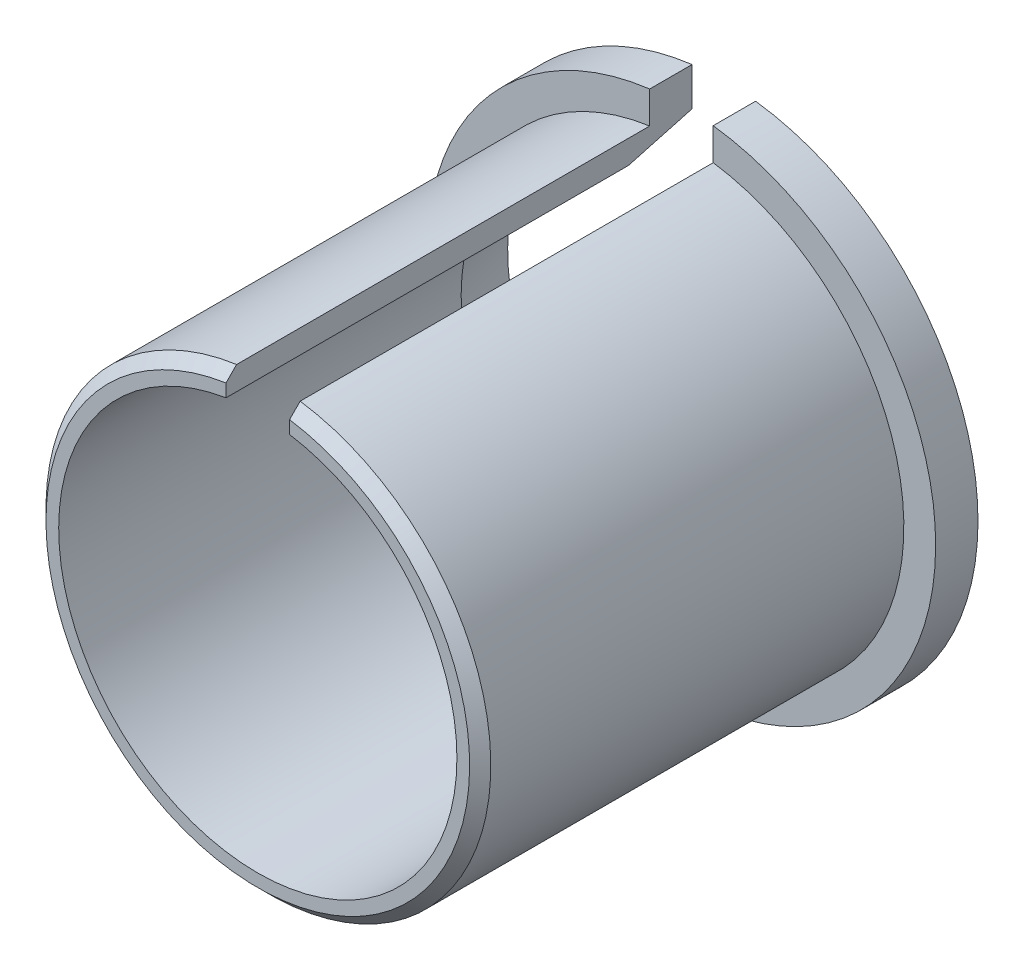
ISO-10303-21;
HEADER;
FILE_DESCRIPTION(('STEP AP214'),'2;1');
FILE_NAME('part.step','',(''),(''),'','','');
FILE_SCHEMA(('AUTOMOTIVE_DESIGN { 1 0 10303 214 1 1 1 1 }'));
ENDSEC;
DATA;
#1=APPLICATION_CONTEXT('core data for automotive mechanical design processes');
#2=APPLICATION_PROTOCOL_DEFINITION('international standard','automotive_design',2000,#1);
#3=PRODUCT_CONTEXT('',#1,'mechanical');
#4=PRODUCT('Part','Part','',(#3));
#5=PRODUCT_RELATED_PRODUCT_CATEGORY('part','',(#4));
#6=PRODUCT_DEFINITION_FORMATION('','',#4);
#7=PRODUCT_DEFINITION_CONTEXT('part definition',#1,'design');
#8=PRODUCT_DEFINITION('design','',#6,#7);
#9=PRODUCT_DEFINITION_SHAPE('','',#8);
#10=(LENGTH_UNIT() NAMED_UNIT(*) SI_UNIT(.MILLI.,.METRE.));
#11=(NAMED_UNIT(*) PLANE_ANGLE_UNIT() SI_UNIT($,.RADIAN.));
#12=(NAMED_UNIT(*) SI_UNIT($,.STERADIAN.) SOLID_ANGLE_UNIT());
#13=UNCERTAINTY_MEASURE_WITH_UNIT(LENGTH_MEASURE(1.E-05),#10,'distance_accuracy_value','');
#14=(GEOMETRIC_REPRESENTATION_CONTEXT(3) GLOBAL_UNCERTAINTY_ASSIGNED_CONTEXT((#13)) GLOBAL_UNIT_ASSIGNED_CONTEXT((#10,
#11,#12)) REPRESENTATION_CONTEXT('',''));
#15=CARTESIAN_POINT('',(0.,0.,0.));
#16=DIRECTION('',(0.,0.,1.));
#17=DIRECTION('',(1.,0.,0.));
#18=AXIS2_PLACEMENT_3D('',#15,#16,#17);
#19=CARTESIAN_POINT('',(0.,0.,-22.));
#20=DIRECTION('',(0.,0.,-1.));
#21=DIRECTION('',(-1.,0.,0.));
#22=AXIS2_PLACEMENT_3D('',#19,#20,#21);
#23=CONICAL_SURFACE('',#22,10.2038475772934,0.261799387799151);
#24=CARTESIAN_POINT('',(0.,0.,-19.));
#25=DIRECTION('',(0.,0.,1.));
#26=DIRECTION('',(1.,0.,0.));
#27=AXIS2_PLACEMENT_3D('',#24,#25,#26);
#28=CIRCLE('',#27,9.4);
#29=CARTESIAN_POINT('',(-1.5,9.27954740275623,-19.));
#30=VERTEX_POINT('',#29);
#31=CARTESIAN_POINT('',(1.5,9.27954740275623,-19.));
#32=VERTEX_POINT('',#31);
#33=EDGE_CURVE('E77',#30,#32,#28,.T.);
#34=ORIENTED_EDGE('',*,*,#33,.T.);
#35=CARTESIAN_POINT('',(1.5,9.27954740275624,-19.));
#36=CARTESIAN_POINT('',(1.5,9.41524604775006,-19.4999662700318));
#37=CARTESIAN_POINT('',(1.5,9.55088249382668,-19.9999494052064));
#38=CARTESIAN_POINT('',(1.5,9.82203098797341,-20.9999494052064));
#39=CARTESIAN_POINT('',(1.5,9.9575430360437,-21.4999662700319));
#40=CARTESIAN_POINT('',(1.5,10.0929928851969,-22.));
#41=B_SPLINE_CURVE_WITH_KNOTS('',3,(#35,#36,#37,#38,#39,#40),.UNSPECIFIED.,.F.,.F.,(4,2,4),(0.,
1.55416325676213,3.10832651155186),.UNSPECIFIED.);
#42=CARTESIAN_POINT('',(1.5,10.0929928851969,-22.));
#43=VERTEX_POINT('',#42);
#44=EDGE_CURVE('E73',#32,#43,#41,.T.);
#45=ORIENTED_EDGE('',*,*,#44,.T.);
#46=CARTESIAN_POINT('',(0.,0.,-22.));
#47=DIRECTION('',(0.,0.,-1.));
#48=DIRECTION('',(-1.,0.,0.));
#49=AXIS2_PLACEMENT_3D('',#46,#47,#48);
#50=CIRCLE('',#49,10.2038475772934);
#51=CARTESIAN_POINT('',(-1.5,10.0929928851969,-22.));
#52=VERTEX_POINT('',#51);
#53=EDGE_CURVE('E20',#43,#52,#50,.T.);
#54=ORIENTED_EDGE('',*,*,#53,.T.);
#55=CARTESIAN_POINT('',(-1.5,10.0929928851969,-22.));
#56=CARTESIAN_POINT('',(-1.5,9.9575430360437,-21.4999662700319));
#57=CARTESIAN_POINT('',(-1.5,9.82203098797341,-20.9999494052064));
#58=CARTESIAN_POINT('',(-1.5,9.55088249382667,-19.9999494052064));
#59=CARTESIAN_POINT('',(-1.5,9.41524604775006,-19.4999662700318));
#60=CARTESIAN_POINT('',(-1.5,9.27954740275623,-19.));
#61=B_SPLINE_CURVE_WITH_KNOTS('',3,(#55,#56,#57,#58,#59,#60),.UNSPECIFIED.,.F.,.F.,(4,2,4),(0.,
1.55416325478973,3.10832651155186),.UNSPECIFIED.);
#62=EDGE_CURVE('E70',#52,#30,#61,.T.);
#63=ORIENTED_EDGE('',*,*,#62,.T.);
#64=EDGE_LOOP('',(#34,#45,#54,#63));
#65=FACE_BOUND('',#64,.T.);
#66=ADVANCED_FACE('F16',(#65),#23,.F.);
#67=CARTESIAN_POINT('',(0.,12.,-22.));
#68=DIRECTION('',(0.,0.,1.));
#69=DIRECTION('',(1.,0.,0.));
#70=AXIS2_PLACEMENT_3D('',#67,#68,#69);
#71=PLANE('',#70);
#72=DIRECTION('',(0.,-1.,0.));
#73=VECTOR('',#72,1.);
#74=CARTESIAN_POINT('',(-1.5,11.9058808997907,-22.));
#75=LINE('',#74,#73);
#76=CARTESIAN_POINT('',(-1.5,11.9058808997907,-22.));
#77=VERTEX_POINT('',#76);
#78=EDGE_CURVE('E79',#77,#52,#75,.T.);
#79=ORIENTED_EDGE('',*,*,#78,.T.);
#80=ORIENTED_EDGE('',*,*,#53,.F.);
#81=DIRECTION('',(0.,1.,0.));
#82=VECTOR('',#81,1.);
#83=CARTESIAN_POINT('',(1.5,11.9058808997907,-22.));
#84=LINE('',#83,#82);
#85=CARTESIAN_POINT('',(1.5,11.9058808997907,-22.));
#86=VERTEX_POINT('',#85);
#87=EDGE_CURVE('E144',#43,#86,#84,.T.);
#88=ORIENTED_EDGE('',*,*,#87,.T.);
#89=CARTESIAN_POINT('',(0.,0.,-22.));
#90=DIRECTION('',(0.,0.,1.));
#91=DIRECTION('',(1.,0.,0.));
#92=AXIS2_PLACEMENT_3D('',#89,#90,#91);
#93=CIRCLE('',#92,12.);
#94=EDGE_CURVE('E81',#77,#86,#93,.T.);
#95=ORIENTED_EDGE('',*,*,#94,.F.);
#96=EDGE_LOOP('',(#79,#80,#88,#95));
#97=FACE_BOUND('',#96,.T.);
#98=ADVANCED_FACE('F80',(#97),#71,.F.);
#99=CARTESIAN_POINT('',(0.,0.,0.));
#100=DIRECTION('',(0.,0.,1.));
#101=DIRECTION('',(1.,0.,0.));
#102=AXIS2_PLACEMENT_3D('',#99,#100,#101);
#103=CYLINDRICAL_SURFACE('',#102,9.4);
#104=ORIENTED_EDGE('',*,*,#33,.F.);
#105=DIRECTION('',(0.,0.,1.));
#106=VECTOR('',#105,1.);
#107=CARTESIAN_POINT('',(-1.5,9.27954740275623,-22.001));
#108=LINE('',#107,#106);
#109=CARTESIAN_POINT('',(-1.5,9.27954740275623,0.));
#110=VERTEX_POINT('',#109);
#111=EDGE_CURVE('E91',#30,#110,#108,.T.);
#112=ORIENTED_EDGE('',*,*,#111,.T.);
#113=CARTESIAN_POINT('',(0.,0.,0.));
#114=DIRECTION('',(0.,0.,1.));
#115=DIRECTION('',(1.,0.,0.));
#116=AXIS2_PLACEMENT_3D('',#113,#114,#115);
#117=CIRCLE('',#116,9.4);
#118=CARTESIAN_POINT('',(1.5,9.27954740275623,0.));
#119=VERTEX_POINT('',#118);
#120=EDGE_CURVE('E145',#110,#119,#117,.T.);
#121=ORIENTED_EDGE('',*,*,#120,.T.);
#122=DIRECTION('',(0.,0.,1.));
#123=VECTOR('',#122,1.);
#124=CARTESIAN_POINT('',(1.5,9.27954740275623,-22.001));
#125=LINE('',#124,#123);
#126=EDGE_CURVE('E189',#119,#32,#125,.F.);
#127=ORIENTED_EDGE('',*,*,#126,.T.);
#128=EDGE_LOOP('',(#104,#112,#121,#127));
#129=FACE_BOUND('',#128,.T.);
#130=ADVANCED_FACE('F112',(#129),#103,.F.);
#131=CARTESIAN_POINT('',(-1.5,11.9058808997907,-22.001));
#132=DIRECTION('',(-1.,0.,0.));
#133=DIRECTION('',(0.,-1.,0.));
#134=AXIS2_PLACEMENT_3D('',#131,#132,#133);
#135=PLANE('',#134);
#136=DIRECTION('',(0.,0.,1.));
#137=VECTOR('',#136,1.);
#138=CARTESIAN_POINT('',(-1.5,11.9058808997907,0.));
#139=LINE('',#138,#137);
#140=CARTESIAN_POINT('',(-1.5,11.9058808997907,-20.));
#141=VERTEX_POINT('',#140);
#142=EDGE_CURVE('E184',#141,#77,#139,.F.);
#143=ORIENTED_EDGE('',*,*,#142,.F.);
#144=DIRECTION('',(0.,-1.,0.));
#145=VECTOR('',#144,1.);
#146=CARTESIAN_POINT('',(-1.5,11.9058808997907,-20.));
#147=LINE('',#146,#145);
#148=CARTESIAN_POINT('',(-1.5,10.3923048454133,-20.));
#149=VERTEX_POINT('',#148);
#150=EDGE_CURVE('E85',#149,#141,#147,.F.);
#151=ORIENTED_EDGE('',*,*,#150,.F.);
#152=DIRECTION('',(0.,0.,1.));
#153=VECTOR('',#152,1.);
#154=CARTESIAN_POINT('',(-1.5,10.3923048454133,0.));
#155=LINE('',#154,#153);
#156=CARTESIAN_POINT('',(-1.5,10.3923048454133,-0.500000000000002));
#157=VERTEX_POINT('',#156);
#158=EDGE_CURVE('E172',#157,#149,#155,.F.);
#159=ORIENTED_EDGE('',*,*,#158,.F.);
#160=CARTESIAN_POINT('',(-1.5,9.88685996664259,0.));
#161=CARTESIAN_POINT('',(-1.5,9.97112303267183,-0.0833108381771129));
#162=CARTESIAN_POINT('',(-1.5,10.055374972269,-0.166632923950458));
#163=CARTESIAN_POINT('',(-1.5,10.2238565985258,-0.333299590617144));
#164=CARTESIAN_POINT('',(-1.5,10.3080862851856,-0.416644171510467));
#165=CARTESIAN_POINT('',(-1.5,10.3923048454133,-0.500000000000002));
#166=B_SPLINE_CURVE_WITH_KNOTS('',3,(#160,#161,#162,#163,#164,#165),.UNSPECIFIED.,.F.,.F.,(4,2,
4),(0.,0.355483661694203,0.710967323079275),.UNSPECIFIED.);
#167=CARTESIAN_POINT('',(-1.5,9.88685996664259,0.));
#168=VERTEX_POINT('',#167);
#169=EDGE_CURVE('E92',#168,#157,#166,.T.);
#170=ORIENTED_EDGE('',*,*,#169,.F.);
#171=DIRECTION('',(0.,1.,0.));
#172=VECTOR('',#171,1.);
#173=CARTESIAN_POINT('',(-1.5,9.4,0.));
#174=LINE('',#173,#172);
#175=EDGE_CURVE('E165',#168,#110,#174,.F.);
#176=ORIENTED_EDGE('',*,*,#175,.T.);
#177=ORIENTED_EDGE('',*,*,#111,.F.);
#178=ORIENTED_EDGE('',*,*,#62,.F.);
#179=ORIENTED_EDGE('',*,*,#78,.F.);
#180=EDGE_LOOP('',(#143,#151,#159,#170,#176,#177,#178,#179));
#181=FACE_BOUND('',#180,.T.);
#182=ADVANCED_FACE('F88',(#181),#135,.F.);
#183=CARTESIAN_POINT('',(0.,0.,0.));
#184=DIRECTION('',(0.,0.,1.));
#185=DIRECTION('',(1.,0.,0.));
#186=AXIS2_PLACEMENT_3D('',#183,#184,#185);
#187=CYLINDRICAL_SURFACE('',#186,12.);
#188=CARTESIAN_POINT('',(0.,0.,-20.));
#189=DIRECTION('',(0.,0.,1.));
#190=DIRECTION('',(1.,0.,0.));
#191=AXIS2_PLACEMENT_3D('',#188,#189,#190);
#192=CIRCLE('',#191,12.);
#193=CARTESIAN_POINT('',(1.5,11.9058808997907,-20.));
#194=VERTEX_POINT('',#193);
#195=EDGE_CURVE('E180',#194,#141,#192,.F.);
#196=ORIENTED_EDGE('',*,*,#195,.T.);
#197=ORIENTED_EDGE('',*,*,#142,.T.);
#198=ORIENTED_EDGE('',*,*,#94,.T.);
#199=DIRECTION('',(0.,0.,1.));
#200=VECTOR('',#199,1.);
#201=CARTESIAN_POINT('',(1.5,11.9058808997907,-22.001));
#202=LINE('',#201,#200);
#203=EDGE_CURVE('E186',#86,#194,#202,.T.);
#204=ORIENTED_EDGE('',*,*,#203,.T.);
#205=EDGE_LOOP('',(#196,#197,#198,#204));
#206=FACE_BOUND('',#205,.T.);
#207=ADVANCED_FACE('F111',(#206),#187,.T.);
#208=CARTESIAN_POINT('',(1.5,11.9058808997907,-22.001));
#209=DIRECTION('',(1.,0.,0.));
#210=DIRECTION('',(0.,1.,0.));
#211=AXIS2_PLACEMENT_3D('',#208,#209,#210);
#212=PLANE('',#211);
#213=ORIENTED_EDGE('',*,*,#44,.F.);
#214=ORIENTED_EDGE('',*,*,#126,.F.);
#215=DIRECTION('',(0.,1.,0.));
#216=VECTOR('',#215,1.);
#217=CARTESIAN_POINT('',(1.5,9.4,0.));
#218=LINE('',#217,#216);
#219=CARTESIAN_POINT('',(1.5,9.88685996664259,0.));
#220=VERTEX_POINT('',#219);
#221=EDGE_CURVE('E143',#119,#220,#218,.T.);
#222=ORIENTED_EDGE('',*,*,#221,.T.);
#223=CARTESIAN_POINT('',(1.5,10.3923048454133,-0.500000000000002));
#224=CARTESIAN_POINT('',(1.5,10.3080862851856,-0.416644171510467));
#225=CARTESIAN_POINT('',(1.5,10.2238565985258,-0.333299590617145));
#226=CARTESIAN_POINT('',(1.5,10.055374972269,-0.166632923950458));
#227=CARTESIAN_POINT('',(1.5,9.97112303267183,-0.0833108381771128));
#228=CARTESIAN_POINT('',(1.5,9.88685996664259,0.));
#229=B_SPLINE_CURVE_WITH_KNOTS('',3,(#223,#224,#225,#226,#227,#228),.UNSPECIFIED.,.F.,.F.,(4,2,
4),(0.,0.355483661385072,0.710967323079275),.UNSPECIFIED.);
#230=CARTESIAN_POINT('',(1.5,10.3923048454133,-0.500000000000002));
#231=VERTEX_POINT('',#230);
#232=EDGE_CURVE('E136',#231,#220,#229,.T.);
#233=ORIENTED_EDGE('',*,*,#232,.F.);
#234=DIRECTION('',(0.,0.,1.));
#235=VECTOR('',#234,1.);
#236=CARTESIAN_POINT('',(1.5,10.3923048454133,0.));
#237=LINE('',#236,#235);
#238=CARTESIAN_POINT('',(1.5,10.3923048454133,-20.));
#239=VERTEX_POINT('',#238);
#240=EDGE_CURVE('E177',#239,#231,#237,.T.);
#241=ORIENTED_EDGE('',*,*,#240,.F.);
#242=DIRECTION('',(0.,1.,0.));
#243=VECTOR('',#242,1.);
#244=CARTESIAN_POINT('',(1.5,10.5,-20.));
#245=LINE('',#244,#243);
#246=EDGE_CURVE('E183',#239,#194,#245,.T.);
#247=ORIENTED_EDGE('',*,*,#246,.T.);
#248=ORIENTED_EDGE('',*,*,#203,.F.);
#249=ORIENTED_EDGE('',*,*,#87,.F.);
#250=EDGE_LOOP('',(#213,#214,#222,#233,#241,#247,#248,#249));
#251=FACE_BOUND('',#250,.T.);
#252=ADVANCED_FACE('F151',(#251),#212,.F.);
#253=CARTESIAN_POINT('',(0.,9.4,0.));
#254=DIRECTION('',(0.,0.,-1.));
#255=DIRECTION('',(-1.,0.,0.));
#256=AXIS2_PLACEMENT_3D('',#253,#254,#255);
#257=PLANE('',#256);
#258=ORIENTED_EDGE('',*,*,#175,.F.);
#259=CARTESIAN_POINT('',(0.,0.,0.));
#260=DIRECTION('',(0.,0.,-1.));
#261=DIRECTION('',(-1.,0.,0.));
#262=AXIS2_PLACEMENT_3D('',#259,#260,#261);
#263=CIRCLE('',#262,10.);
#264=EDGE_CURVE('E167',#220,#168,#263,.T.);
#265=ORIENTED_EDGE('',*,*,#264,.F.);
#266=ORIENTED_EDGE('',*,*,#221,.F.);
#267=ORIENTED_EDGE('',*,*,#120,.F.);
#268=EDGE_LOOP('',(#258,#265,#266,#267));
#269=FACE_BOUND('',#268,.T.);
#270=ADVANCED_FACE('F154',(#269),#257,.F.);
#271=CARTESIAN_POINT('',(0.,10.5,-20.));
#272=DIRECTION('',(0.,0.,-1.));
#273=DIRECTION('',(-1.,0.,0.));
#274=AXIS2_PLACEMENT_3D('',#271,#272,#273);
#275=PLANE('',#274);
#276=ORIENTED_EDGE('',*,*,#150,.T.);
#277=ORIENTED_EDGE('',*,*,#195,.F.);
#278=ORIENTED_EDGE('',*,*,#246,.F.);
#279=CARTESIAN_POINT('',(0.,0.,-20.));
#280=DIRECTION('',(0.,0.,1.));
#281=DIRECTION('',(1.,0.,0.));
#282=AXIS2_PLACEMENT_3D('',#279,#280,#281);
#283=CIRCLE('',#282,10.5);
#284=EDGE_CURVE('E26',#149,#239,#283,.T.);
#285=ORIENTED_EDGE('',*,*,#284,.F.);
#286=EDGE_LOOP('',(#276,#277,#278,#285));
#287=FACE_BOUND('',#286,.T.);
#288=ADVANCED_FACE('F130',(#287),#275,.F.);
#289=CARTESIAN_POINT('',(0.,0.,-0.500000000000004));
#290=DIRECTION('',(0.,0.,-1.));
#291=DIRECTION('',(-1.,0.,0.));
#292=AXIS2_PLACEMENT_3D('',#289,#290,#291);
#293=CONICAL_SURFACE('',#292,10.5,0.785398163397447);
#294=ORIENTED_EDGE('',*,*,#264,.T.);
#295=ORIENTED_EDGE('',*,*,#169,.T.);
#296=CARTESIAN_POINT('',(0.,0.,-0.500000000000002));
#297=DIRECTION('',(0.,0.,1.));
#298=DIRECTION('',(1.,0.,0.));
#299=AXIS2_PLACEMENT_3D('',#296,#297,#298);
#300=CIRCLE('',#299,10.5);
#301=EDGE_CURVE('E11',#231,#157,#300,.F.);
#302=ORIENTED_EDGE('',*,*,#301,.F.);
#303=ORIENTED_EDGE('',*,*,#232,.T.);
#304=EDGE_LOOP('',(#294,#295,#302,#303));
#305=FACE_BOUND('',#304,.T.);
#306=ADVANCED_FACE('F124',(#305),#293,.T.);
#307=CARTESIAN_POINT('',(0.,0.,0.));
#308=DIRECTION('',(0.,0.,1.));
#309=DIRECTION('',(1.,0.,0.));
#310=AXIS2_PLACEMENT_3D('',#307,#308,#309);
#311=CYLINDRICAL_SURFACE('',#310,10.5);
#312=ORIENTED_EDGE('',*,*,#284,.T.);
#313=ORIENTED_EDGE('',*,*,#240,.T.);
#314=ORIENTED_EDGE('',*,*,#301,.T.);
#315=ORIENTED_EDGE('',*,*,#158,.T.);
#316=EDGE_LOOP('',(#312,#313,#314,#315));
#317=FACE_BOUND('',#316,.T.);
#318=ADVANCED_FACE('F122',(#317),#311,.T.);
#319=CLOSED_SHELL('',(#66,#98,#130,#182,#207,#252,#270,#288,#306,#318));
#320=MANIFOLD_SOLID_BREP('B1',#319);
#321=ADVANCED_BREP_SHAPE_REPRESENTATION('',(#18,#320),#14);
#322=SHAPE_DEFINITION_REPRESENTATION(#9,#321);
ENDSEC;
END-ISO-10303-21;
